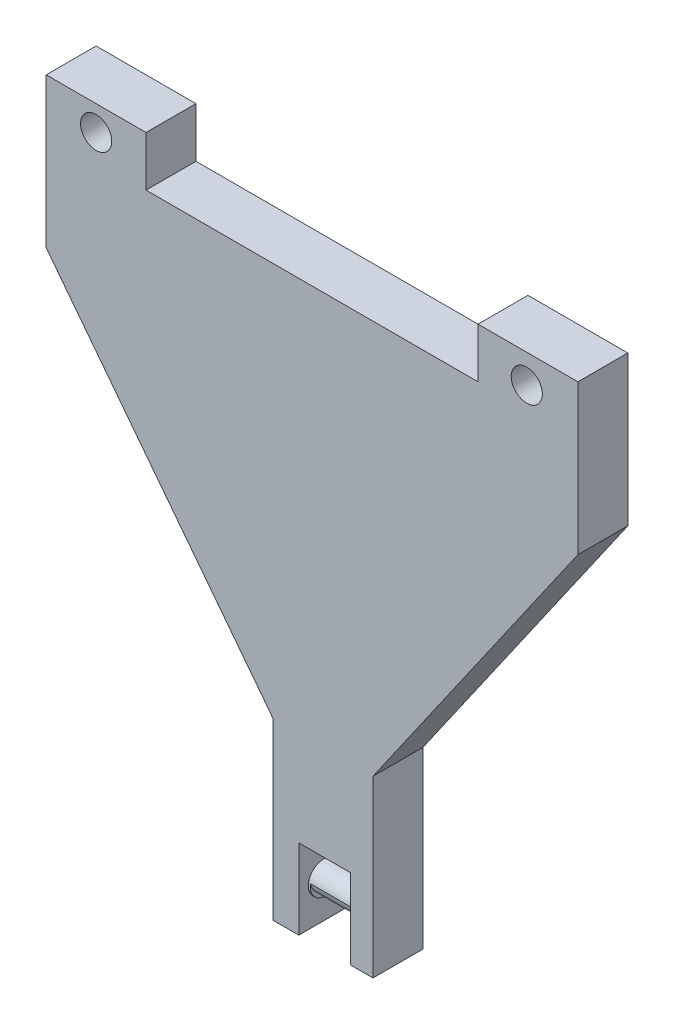
ISO-10303-21;
HEADER;
FILE_DESCRIPTION(('STEP AP214'),'2;1');
FILE_NAME('part.step','',(''),(''),'','','');
FILE_SCHEMA(('AUTOMOTIVE_DESIGN { 1 0 10303 214 1 1 1 1 }'));
ENDSEC;
DATA;
#1=APPLICATION_CONTEXT('core data for automotive mechanical design processes');
#2=APPLICATION_PROTOCOL_DEFINITION('international standard','automotive_design',2000,#1);
#3=PRODUCT_CONTEXT('',#1,'mechanical');
#4=PRODUCT('Part','Part','',(#3));
#5=PRODUCT_RELATED_PRODUCT_CATEGORY('part','',(#4));
#6=PRODUCT_DEFINITION_FORMATION('','',#4);
#7=PRODUCT_DEFINITION_CONTEXT('part definition',#1,'design');
#8=PRODUCT_DEFINITION('design','',#6,#7);
#9=PRODUCT_DEFINITION_SHAPE('','',#8);
#10=(LENGTH_UNIT() NAMED_UNIT(*) SI_UNIT(.MILLI.,.METRE.));
#11=(NAMED_UNIT(*) PLANE_ANGLE_UNIT() SI_UNIT($,.RADIAN.));
#12=(NAMED_UNIT(*) SI_UNIT($,.STERADIAN.) SOLID_ANGLE_UNIT());
#13=UNCERTAINTY_MEASURE_WITH_UNIT(LENGTH_MEASURE(1.E-05),#10,'distance_accuracy_value','');
#14=(GEOMETRIC_REPRESENTATION_CONTEXT(3) GLOBAL_UNCERTAINTY_ASSIGNED_CONTEXT((#13)) GLOBAL_UNIT_ASSIGNED_CONTEXT((#10,
#11,#12)) REPRESENTATION_CONTEXT('',''));
#15=CARTESIAN_POINT('',(0.,0.,0.));
#16=DIRECTION('',(0.,0.,1.));
#17=DIRECTION('',(1.,0.,0.));
#18=AXIS2_PLACEMENT_3D('',#15,#16,#17);
#19=CARTESIAN_POINT('',(0.,0.,0.));
#20=DIRECTION('',(0.,0.,1.));
#21=DIRECTION('',(1.,0.,0.));
#22=AXIS2_PLACEMENT_3D('',#19,#20,#21);
#23=PLANE('',#22);
#24=CARTESIAN_POINT('',(-21.971,38.1,0.));
#25=DIRECTION('',(0.,0.,1.));
#26=DIRECTION('',(1.,0.,0.));
#27=AXIS2_PLACEMENT_3D('',#24,#25,#26);
#28=CIRCLE('',#27,1.5875);
#29=CARTESIAN_POINT('',(-20.3835,38.1,0.));
#30=VERTEX_POINT('',#29);
#31=EDGE_CURVE('E209',#30,#30,#28,.T.);
#32=ORIENTED_EDGE('',*,*,#31,.T.);
#33=EDGE_LOOP('',(#32));
#34=FACE_BOUND('',#33,.T.);
#35=CARTESIAN_POINT('',(21.8511818454124,37.7412991391645,0.));
#36=DIRECTION('',(0.,0.,-1.));
#37=DIRECTION('',(-1.,0.,0.));
#38=AXIS2_PLACEMENT_3D('',#35,#36,#37);
#39=CIRCLE('',#38,1.5875);
#40=CARTESIAN_POINT('',(20.2636818454124,37.7412991391645,0.));
#41=VERTEX_POINT('',#40);
#42=EDGE_CURVE('E213',#41,#41,#39,.T.);
#43=ORIENTED_EDGE('',*,*,#42,.F.);
#44=EDGE_LOOP('',(#43));
#45=FACE_BOUND('',#44,.T.);
#46=DIRECTION('',(-1.,0.,0.));
#47=VECTOR('',#46,1.);
#48=CARTESIAN_POINT('',(3.93247962115445,-12.3472449566522,0.));
#49=LINE('',#48,#47);
#50=CARTESIAN_POINT('',(3.93247962115445,-12.3472449566522,0.));
#51=VERTEX_POINT('',#50);
#52=CARTESIAN_POINT('',(-1.14752037884556,-12.3472449566522,0.));
#53=VERTEX_POINT('',#52);
#54=EDGE_CURVE('E207',#51,#53,#49,.T.);
#55=ORIENTED_EDGE('',*,*,#54,.T.);
#56=DIRECTION('',(1.,0.,0.));
#57=VECTOR('',#56,1.);
#58=CARTESIAN_POINT('',(-6.94932177100705,-12.3472449566522,0.));
#59=LINE('',#58,#57);
#60=CARTESIAN_POINT('',(-1.34909444897592,-12.3472449566522,0.));
#61=VERTEX_POINT('',#60);
#62=EDGE_CURVE('E171',#61,#53,#59,.T.);
#63=ORIENTED_EDGE('',*,*,#62,.F.);
#64=DIRECTION('',(0.,1.,0.));
#65=VECTOR('',#64,1.);
#66=CARTESIAN_POINT('',(-1.34909444897592,0.,0.));
#67=LINE('',#66,#65);
#68=CARTESIAN_POINT('',(-1.34909444897592,-22.3246142518571,0.));
#69=VERTEX_POINT('',#68);
#70=EDGE_CURVE('E210',#69,#61,#67,.T.);
#71=ORIENTED_EDGE('',*,*,#70,.F.);
#72=DIRECTION('',(-1.,0.,0.));
#73=VECTOR('',#72,1.);
#74=CARTESIAN_POINT('',(0.,-22.3246142518571,0.));
#75=LINE('',#74,#73);
#76=CARTESIAN_POINT('',(-3.96283486472127,-22.3246142518571,0.));
#77=VERTEX_POINT('',#76);
#78=EDGE_CURVE('E251',#69,#77,#75,.T.);
#79=ORIENTED_EDGE('',*,*,#78,.T.);
#80=DIRECTION('',(0.,1.,0.));
#81=VECTOR('',#80,1.);
#82=CARTESIAN_POINT('',(-3.96283486472127,0.,0.));
#83=LINE('',#82,#81);
#84=CARTESIAN_POINT('',(-3.96283486472127,-4.54461425185706,0.));
#85=VERTEX_POINT('',#84);
#86=EDGE_CURVE('E272',#77,#85,#83,.T.);
#87=ORIENTED_EDGE('',*,*,#86,.T.);
#88=DIRECTION('',(-0.610605042103083,0.791935276748228,0.));
#89=VECTOR('',#88,1.);
#90=CARTESIAN_POINT('',(-4.68292957043946,-3.61067437135147,0.));
#91=LINE('',#90,#89);
#92=CARTESIAN_POINT('',(-27.051,25.4,0.));
#93=VERTEX_POINT('',#92);
#94=EDGE_CURVE('E317',#85,#93,#91,.T.);
#95=ORIENTED_EDGE('',*,*,#94,.T.);
#96=DIRECTION('',(0.,-1.,0.));
#97=VECTOR('',#96,1.);
#98=CARTESIAN_POINT('',(-27.051,30.48,0.));
#99=LINE('',#98,#97);
#100=CARTESIAN_POINT('',(-27.051,40.64,0.));
#101=VERTEX_POINT('',#100);
#102=EDGE_CURVE('E234',#101,#93,#99,.T.);
#103=ORIENTED_EDGE('',*,*,#102,.F.);
#104=DIRECTION('',(-1.,0.,0.));
#105=VECTOR('',#104,1.);
#106=CARTESIAN_POINT('',(-27.051,40.64,0.));
#107=LINE('',#106,#105);
#108=CARTESIAN_POINT('',(-16.891,40.64,0.));
#109=VERTEX_POINT('',#108);
#110=EDGE_CURVE('E230',#109,#101,#107,.T.);
#111=ORIENTED_EDGE('',*,*,#110,.F.);
#112=DIRECTION('',(0.,1.,0.));
#113=VECTOR('',#112,1.);
#114=CARTESIAN_POINT('',(-16.891,40.64,0.));
#115=LINE('',#114,#113);
#116=CARTESIAN_POINT('',(-16.891,35.56,0.));
#117=VERTEX_POINT('',#116);
#118=EDGE_CURVE('E226',#117,#109,#115,.T.);
#119=ORIENTED_EDGE('',*,*,#118,.F.);
#120=DIRECTION('',(-1.,0.,0.));
#121=VECTOR('',#120,1.);
#122=CARTESIAN_POINT('',(-16.891,35.56,0.));
#123=LINE('',#122,#121);
#124=CARTESIAN_POINT('',(16.891,35.56,0.));
#125=VERTEX_POINT('',#124);
#126=EDGE_CURVE('E222',#125,#117,#123,.T.);
#127=ORIENTED_EDGE('',*,*,#126,.F.);
#128=DIRECTION('',(0.,-1.,0.));
#129=VECTOR('',#128,1.);
#130=CARTESIAN_POINT('',(16.891,40.64,0.));
#131=LINE('',#130,#129);
#132=CARTESIAN_POINT('',(16.891,40.64,0.));
#133=VERTEX_POINT('',#132);
#134=EDGE_CURVE('E217',#133,#125,#131,.T.);
#135=ORIENTED_EDGE('',*,*,#134,.F.);
#136=DIRECTION('',(-1.,0.,0.));
#137=VECTOR('',#136,1.);
#138=CARTESIAN_POINT('',(27.051,40.64,0.));
#139=LINE('',#138,#137);
#140=CARTESIAN_POINT('',(27.051,40.64,0.));
#141=VERTEX_POINT('',#140);
#142=EDGE_CURVE('E218',#141,#133,#139,.T.);
#143=ORIENTED_EDGE('',*,*,#142,.F.);
#144=DIRECTION('',(0.,1.,0.));
#145=VECTOR('',#144,1.);
#146=CARTESIAN_POINT('',(27.051,40.64,0.));
#147=LINE('',#146,#145);
#148=CARTESIAN_POINT('',(27.051,25.4,0.));
#149=VERTEX_POINT('',#148);
#150=EDGE_CURVE('E249',#149,#141,#147,.T.);
#151=ORIENTED_EDGE('',*,*,#150,.F.);
#152=DIRECTION('',(0.571483757681356,0.820613377118846,0.));
#153=VECTOR('',#152,1.);
#154=CARTESIAN_POINT('',(6.3045469235923,-4.39055256328238,0.));
#155=LINE('',#154,#153);
#156=CARTESIAN_POINT('',(6.19725674875928,-4.54461425185706,0.));
#157=VERTEX_POINT('',#156);
#158=EDGE_CURVE('E292',#157,#149,#155,.T.);
#159=ORIENTED_EDGE('',*,*,#158,.F.);
#160=DIRECTION('',(0.,1.,0.));
#161=VECTOR('',#160,1.);
#162=CARTESIAN_POINT('',(6.19725674875928,0.,0.));
#163=LINE('',#162,#161);
#164=CARTESIAN_POINT('',(6.19725674875928,-22.3246142518571,0.));
#165=VERTEX_POINT('',#164);
#166=EDGE_CURVE('E288',#165,#157,#163,.T.);
#167=ORIENTED_EDGE('',*,*,#166,.F.);
#168=DIRECTION('',(1.,0.,0.));
#169=VECTOR('',#168,1.);
#170=CARTESIAN_POINT('',(0.,-22.3246142518571,0.));
#171=LINE('',#170,#169);
#172=CARTESIAN_POINT('',(3.93247962115445,-22.3246142518571,0.));
#173=VERTEX_POINT('',#172);
#174=EDGE_CURVE('E282',#173,#165,#171,.T.);
#175=ORIENTED_EDGE('',*,*,#174,.F.);
#176=DIRECTION('',(0.,-1.,0.));
#177=VECTOR('',#176,1.);
#178=CARTESIAN_POINT('',(3.93247962115444,0.,0.));
#179=LINE('',#178,#177);
#180=EDGE_CURVE('E56',#51,#173,#179,.T.);
#181=ORIENTED_EDGE('',*,*,#180,.F.);
#182=EDGE_LOOP('',(#55,#63,#71,#79,#87,#95,#103,#111,#119,#127,#135,#143,#151,#159,#167,#175,#181));
#183=FACE_BOUND('',#182,.T.);
#184=ADVANCED_FACE('F34',(#34,#45,#183),#23,.F.);
#185=CARTESIAN_POINT('',(3.73090555102408,-4.12298634862399,-50.0634));
#186=DIRECTION('',(-1.,0.,0.));
#187=DIRECTION('',(0.,1.,0.));
#188=AXIS2_PLACEMENT_3D('',#185,#186,#187);
#189=PLANE('',#188);
#190=CARTESIAN_POINT('',(3.73090555102408,-18.4560908265641,2.51857716498938));
#191=DIRECTION('',(-1.,0.,0.));
#192=DIRECTION('',(0.,1.,0.));
#193=AXIS2_PLACEMENT_3D('',#190,#191,#192);
#194=CIRCLE('',#193,1.5875);
#195=CARTESIAN_POINT('',(3.73090555102408,-18.1969949144053,4.0847909301896));
#196=VERTEX_POINT('',#195);
#197=CARTESIAN_POINT('',(3.73090555102408,-18.1969949144053,0.952363399789171));
#198=VERTEX_POINT('',#197);
#199=EDGE_CURVE('E279',#196,#198,#194,.T.);
#200=ORIENTED_EDGE('',*,*,#199,.F.);
#201=CARTESIAN_POINT('',(3.73090555102408,-17.9378990022466,2.51857716498938));
#202=DIRECTION('',(-1.,0.,0.));
#203=DIRECTION('',(0.,-1.,0.));
#204=AXIS2_PLACEMENT_3D('',#201,#202,#203);
#205=CIRCLE('',#204,1.5875);
#206=EDGE_CURVE('E48',#196,#198,#205,.T.);
#207=ORIENTED_EDGE('',*,*,#206,.T.);
#208=EDGE_LOOP('',(#200,#207));
#209=FACE_BOUND('',#208,.T.);
#210=ADVANCED_FACE('F341',(#209),#189,.T.);
#211=CARTESIAN_POINT('',(0.,0.,5.08));
#212=DIRECTION('',(0.,0.,1.));
#213=DIRECTION('',(1.,0.,0.));
#214=AXIS2_PLACEMENT_3D('',#211,#212,#213);
#215=PLANE('',#214);
#216=DIRECTION('',(1.,0.,0.));
#217=VECTOR('',#216,1.);
#218=CARTESIAN_POINT('',(-6.94932177100705,-14.1862009975363,5.07999999999998));
#219=LINE('',#218,#217);
#220=CARTESIAN_POINT('',(-1.34909444897592,-14.1862009975363,5.07999999999998));
#221=VERTEX_POINT('',#220);
#222=CARTESIAN_POINT('',(-1.14752037884555,-14.1862009975363,5.07999999999998));
#223=VERTEX_POINT('',#222);
#224=EDGE_CURVE('E169',#221,#223,#219,.T.);
#225=ORIENTED_EDGE('',*,*,#224,.T.);
#226=DIRECTION('',(-1.,0.,0.));
#227=VECTOR('',#226,1.);
#228=CARTESIAN_POINT('',(3.93247962115445,-14.1862009975362,5.08));
#229=LINE('',#228,#227);
#230=CARTESIAN_POINT('',(3.93247962115445,-14.1862009975363,5.07999999999998));
#231=VERTEX_POINT('',#230);
#232=EDGE_CURVE('E11',#231,#223,#229,.T.);
#233=ORIENTED_EDGE('',*,*,#232,.F.);
#234=DIRECTION('',(0.,-1.,0.));
#235=VECTOR('',#234,1.);
#236=CARTESIAN_POINT('',(3.93247962115444,0.,5.08));
#237=LINE('',#236,#235);
#238=CARTESIAN_POINT('',(3.93247962115445,-22.3246142518571,5.08));
#239=VERTEX_POINT('',#238);
#240=EDGE_CURVE('E196',#231,#239,#237,.T.);
#241=ORIENTED_EDGE('',*,*,#240,.T.);
#242=DIRECTION('',(1.,0.,0.));
#243=VECTOR('',#242,1.);
#244=CARTESIAN_POINT('',(0.,-22.3246142518571,5.08));
#245=LINE('',#244,#243);
#246=CARTESIAN_POINT('',(6.19725674875928,-22.3246142518571,5.08));
#247=VERTEX_POINT('',#246);
#248=EDGE_CURVE('E278',#239,#247,#245,.T.);
#249=ORIENTED_EDGE('',*,*,#248,.T.);
#250=DIRECTION('',(0.,1.,0.));
#251=VECTOR('',#250,1.);
#252=CARTESIAN_POINT('',(6.19725674875928,0.,5.08));
#253=LINE('',#252,#251);
#254=CARTESIAN_POINT('',(6.19725674875928,-4.54461425185706,5.08));
#255=VERTEX_POINT('',#254);
#256=EDGE_CURVE('E312',#247,#255,#253,.T.);
#257=ORIENTED_EDGE('',*,*,#256,.T.);
#258=DIRECTION('',(0.571483757681356,0.820613377118846,0.));
#259=VECTOR('',#258,1.);
#260=CARTESIAN_POINT('',(6.3045469235923,-4.39055256328238,5.08));
#261=LINE('',#260,#259);
#262=CARTESIAN_POINT('',(27.051,25.4,5.08));
#263=VERTEX_POINT('',#262);
#264=EDGE_CURVE('E267',#255,#263,#261,.T.);
#265=ORIENTED_EDGE('',*,*,#264,.T.);
#266=DIRECTION('',(0.,1.,0.));
#267=VECTOR('',#266,1.);
#268=CARTESIAN_POINT('',(27.051,-40.64,5.08));
#269=LINE('',#268,#267);
#270=CARTESIAN_POINT('',(27.051,40.64,5.08));
#271=VERTEX_POINT('',#270);
#272=EDGE_CURVE('E265',#263,#271,#269,.T.);
#273=ORIENTED_EDGE('',*,*,#272,.T.);
#274=DIRECTION('',(-1.,0.,0.));
#275=VECTOR('',#274,1.);
#276=CARTESIAN_POINT('',(27.051,40.64,5.08));
#277=LINE('',#276,#275);
#278=CARTESIAN_POINT('',(16.891,40.64,5.08));
#279=VERTEX_POINT('',#278);
#280=EDGE_CURVE('E263',#271,#279,#277,.T.);
#281=ORIENTED_EDGE('',*,*,#280,.T.);
#282=DIRECTION('',(0.,-1.,0.));
#283=VECTOR('',#282,1.);
#284=CARTESIAN_POINT('',(16.891,40.64,5.08));
#285=LINE('',#284,#283);
#286=CARTESIAN_POINT('',(16.891,35.56,5.08));
#287=VERTEX_POINT('',#286);
#288=EDGE_CURVE('E261',#279,#287,#285,.T.);
#289=ORIENTED_EDGE('',*,*,#288,.T.);
#290=DIRECTION('',(-1.,0.,0.));
#291=VECTOR('',#290,1.);
#292=CARTESIAN_POINT('',(-16.891,35.56,5.08));
#293=LINE('',#292,#291);
#294=CARTESIAN_POINT('',(-16.891,35.56,5.08));
#295=VERTEX_POINT('',#294);
#296=EDGE_CURVE('E259',#287,#295,#293,.T.);
#297=ORIENTED_EDGE('',*,*,#296,.T.);
#298=DIRECTION('',(0.,1.,0.));
#299=VECTOR('',#298,1.);
#300=CARTESIAN_POINT('',(-16.891,40.64,5.08));
#301=LINE('',#300,#299);
#302=CARTESIAN_POINT('',(-16.891,40.64,5.08));
#303=VERTEX_POINT('',#302);
#304=EDGE_CURVE('E257',#295,#303,#301,.T.);
#305=ORIENTED_EDGE('',*,*,#304,.T.);
#306=DIRECTION('',(-1.,0.,0.));
#307=VECTOR('',#306,1.);
#308=CARTESIAN_POINT('',(-27.051,40.64,5.08));
#309=LINE('',#308,#307);
#310=CARTESIAN_POINT('',(-27.051,40.64,5.08));
#311=VERTEX_POINT('',#310);
#312=EDGE_CURVE('E255',#303,#311,#309,.T.);
#313=ORIENTED_EDGE('',*,*,#312,.T.);
#314=DIRECTION('',(0.,-1.,0.));
#315=VECTOR('',#314,1.);
#316=CARTESIAN_POINT('',(-27.051,40.64,5.08));
#317=LINE('',#316,#315);
#318=CARTESIAN_POINT('',(-27.051,25.4,5.08));
#319=VERTEX_POINT('',#318);
#320=EDGE_CURVE('E252',#311,#319,#317,.T.);
#321=ORIENTED_EDGE('',*,*,#320,.T.);
#322=DIRECTION('',(-0.610605042103083,0.791935276748228,0.));
#323=VECTOR('',#322,1.);
#324=CARTESIAN_POINT('',(-4.68292957043946,-3.61067437135147,5.08));
#325=LINE('',#324,#323);
#326=CARTESIAN_POINT('',(-3.96283486472127,-4.54461425185706,5.08));
#327=VERTEX_POINT('',#326);
#328=EDGE_CURVE('E287',#327,#319,#325,.T.);
#329=ORIENTED_EDGE('',*,*,#328,.F.);
#330=DIRECTION('',(0.,1.,0.));
#331=VECTOR('',#330,1.);
#332=CARTESIAN_POINT('',(-3.96283486472127,0.,5.08));
#333=LINE('',#332,#331);
#334=CARTESIAN_POINT('',(-3.96283486472127,-22.3246142518571,5.08));
#335=VERTEX_POINT('',#334);
#336=EDGE_CURVE('E299',#335,#327,#333,.T.);
#337=ORIENTED_EDGE('',*,*,#336,.F.);
#338=DIRECTION('',(-1.,0.,0.));
#339=VECTOR('',#338,1.);
#340=CARTESIAN_POINT('',(0.,-22.3246142518571,5.08));
#341=LINE('',#340,#339);
#342=CARTESIAN_POINT('',(-1.34909444897592,-22.3246142518571,5.08));
#343=VERTEX_POINT('',#342);
#344=EDGE_CURVE('E296',#343,#335,#341,.T.);
#345=ORIENTED_EDGE('',*,*,#344,.F.);
#346=DIRECTION('',(0.,1.,0.));
#347=VECTOR('',#346,1.);
#348=CARTESIAN_POINT('',(-1.34909444897592,0.,5.08));
#349=LINE('',#348,#347);
#350=EDGE_CURVE('E183',#343,#221,#349,.T.);
#351=ORIENTED_EDGE('',*,*,#350,.T.);
#352=EDGE_LOOP('',(#225,#233,#241,#249,#257,#265,#273,#281,#289,#297,#305,#313,#321,#329,#337,
#345,#351));
#353=FACE_BOUND('',#352,.T.);
#354=CARTESIAN_POINT('',(21.8511818454124,37.7412991391645,5.08));
#355=DIRECTION('',(0.,0.,-1.));
#356=DIRECTION('',(-1.,0.,0.));
#357=AXIS2_PLACEMENT_3D('',#354,#355,#356);
#358=CIRCLE('',#357,1.5875);
#359=CARTESIAN_POINT('',(20.2636818454124,37.7412991391645,5.08));
#360=VERTEX_POINT('',#359);
#361=EDGE_CURVE('E248',#360,#360,#358,.T.);
#362=ORIENTED_EDGE('',*,*,#361,.T.);
#363=EDGE_LOOP('',(#362));
#364=FACE_BOUND('',#363,.T.);
#365=CARTESIAN_POINT('',(-21.971,38.1,5.08));
#366=DIRECTION('',(0.,0.,1.));
#367=DIRECTION('',(1.,0.,0.));
#368=AXIS2_PLACEMENT_3D('',#365,#366,#367);
#369=CIRCLE('',#368,1.5875);
#370=CARTESIAN_POINT('',(-20.3835,38.1,5.08));
#371=VERTEX_POINT('',#370);
#372=EDGE_CURVE('E238',#371,#371,#369,.T.);
#373=ORIENTED_EDGE('',*,*,#372,.F.);
#374=EDGE_LOOP('',(#373));
#375=FACE_BOUND('',#374,.T.);
#376=ADVANCED_FACE('F178',(#353,#364,#375),#215,.T.);
#377=CARTESIAN_POINT('',(3.73093055102408,-18.4560908265641,2.51857716498938));
#378=DIRECTION('',(-1.,0.,0.));
#379=DIRECTION('',(0.,1.,0.));
#380=AXIS2_PLACEMENT_3D('',#377,#378,#379);
#381=CYLINDRICAL_SURFACE('',#380,1.5875);
#382=CARTESIAN_POINT('',(-1.34909444897592,-18.4560908265641,2.51857716498938));
#383=DIRECTION('',(-1.,0.,0.));
#384=DIRECTION('',(0.,1.,0.));
#385=AXIS2_PLACEMENT_3D('',#382,#383,#384);
#386=CIRCLE('',#385,1.5875);
#387=CARTESIAN_POINT('',(-1.34909444897592,-16.8685908265641,2.51857716498938));
#388=VERTEX_POINT('',#387);
#389=EDGE_CURVE('E212',#388,#388,#386,.T.);
#390=ORIENTED_EDGE('',*,*,#389,.F.);
#391=EDGE_LOOP('',(#390));
#392=FACE_BOUND('',#391,.T.);
#393=ORIENTED_EDGE('',*,*,#199,.T.);
#394=DIRECTION('',(-1.,0.,0.));
#395=VECTOR('',#394,1.);
#396=CARTESIAN_POINT('',(1.39247962115445,-18.1969949144053,0.95236339978917));
#397=LINE('',#396,#395);
#398=CARTESIAN_POINT('',(-1.14752037884555,-18.1969949144053,0.95236339978917));
#399=VERTEX_POINT('',#398);
#400=EDGE_CURVE('E41',#198,#399,#397,.T.);
#401=ORIENTED_EDGE('',*,*,#400,.T.);
#402=CARTESIAN_POINT('',(-1.14752037884555,-18.4560908265641,2.51857716498938));
#403=DIRECTION('',(1.,0.,0.));
#404=DIRECTION('',(0.,1.,0.));
#405=AXIS2_PLACEMENT_3D('',#402,#403,#404);
#406=CIRCLE('',#405,1.5875);
#407=CARTESIAN_POINT('',(-1.14752037884555,-18.1969949144053,4.0847909301896));
#408=VERTEX_POINT('',#407);
#409=EDGE_CURVE('E330',#399,#408,#406,.F.);
#410=ORIENTED_EDGE('',*,*,#409,.T.);
#411=DIRECTION('',(-1.,0.,0.));
#412=VECTOR('',#411,1.);
#413=CARTESIAN_POINT('',(1.39247962115445,-18.1969949144053,4.0847909301896));
#414=LINE('',#413,#412);
#415=EDGE_CURVE('E328',#408,#196,#414,.F.);
#416=ORIENTED_EDGE('',*,*,#415,.T.);
#417=EDGE_LOOP('',(#393,#401,#410,#416));
#418=FACE_BOUND('',#417,.T.);
#419=ADVANCED_FACE('F334',(#392,#418),#381,.T.);
#420=CARTESIAN_POINT('',(0.,-22.3246142518571,0.));
#421=DIRECTION('',(0.,-1.,0.));
#422=DIRECTION('',(0.,0.,-1.));
#423=AXIS2_PLACEMENT_3D('',#420,#421,#422);
#424=PLANE('',#423);
#425=ORIENTED_EDGE('',*,*,#248,.F.);
#426=DIRECTION('',(0.,0.,-1.));
#427=VECTOR('',#426,1.);
#428=CARTESIAN_POINT('',(3.93247962115445,-22.3246142518571,0.));
#429=LINE('',#428,#427);
#430=EDGE_CURVE('E295',#239,#173,#429,.T.);
#431=ORIENTED_EDGE('',*,*,#430,.T.);
#432=ORIENTED_EDGE('',*,*,#174,.T.);
#433=DIRECTION('',(0.,0.,1.));
#434=VECTOR('',#433,1.);
#435=CARTESIAN_POINT('',(6.19725674875928,-22.3246142518571,0.));
#436=LINE('',#435,#434);
#437=EDGE_CURVE('E289',#165,#247,#436,.T.);
#438=ORIENTED_EDGE('',*,*,#437,.T.);
#439=EDGE_LOOP('',(#425,#431,#432,#438));
#440=FACE_BOUND('',#439,.T.);
#441=ADVANCED_FACE('F358',(#440),#424,.T.);
#442=CARTESIAN_POINT('',(27.051,40.64,5.08));
#443=DIRECTION('',(-1.,0.,0.));
#444=DIRECTION('',(0.,-1.,0.));
#445=AXIS2_PLACEMENT_3D('',#442,#443,#444);
#446=PLANE('',#445);
#447=DIRECTION('',(0.,0.,1.));
#448=VECTOR('',#447,1.);
#449=CARTESIAN_POINT('',(27.051,25.4,0.));
#450=LINE('',#449,#448);
#451=EDGE_CURVE('E304',#149,#263,#450,.T.);
#452=ORIENTED_EDGE('',*,*,#451,.F.);
#453=ORIENTED_EDGE('',*,*,#150,.T.);
#454=DIRECTION('',(0.,0.,-1.));
#455=VECTOR('',#454,1.);
#456=CARTESIAN_POINT('',(27.051,40.64,5.08));
#457=LINE('',#456,#455);
#458=EDGE_CURVE('E214',#271,#141,#457,.T.);
#459=ORIENTED_EDGE('',*,*,#458,.F.);
#460=ORIENTED_EDGE('',*,*,#272,.F.);
#461=EDGE_LOOP('',(#452,#453,#459,#460));
#462=FACE_BOUND('',#461,.T.);
#463=ADVANCED_FACE('F371',(#462),#446,.F.);
#464=CARTESIAN_POINT('',(27.051,40.64,5.08));
#465=DIRECTION('',(0.,-1.,0.));
#466=DIRECTION('',(1.,0.,0.));
#467=AXIS2_PLACEMENT_3D('',#464,#465,#466);
#468=PLANE('',#467);
#469=ORIENTED_EDGE('',*,*,#142,.T.);
#470=DIRECTION('',(0.,0.,-1.));
#471=VECTOR('',#470,1.);
#472=CARTESIAN_POINT('',(16.891,40.64,5.08));
#473=LINE('',#472,#471);
#474=EDGE_CURVE('E219',#279,#133,#473,.T.);
#475=ORIENTED_EDGE('',*,*,#474,.F.);
#476=ORIENTED_EDGE('',*,*,#280,.F.);
#477=ORIENTED_EDGE('',*,*,#458,.T.);
#478=EDGE_LOOP('',(#469,#475,#476,#477));
#479=FACE_BOUND('',#478,.T.);
#480=ADVANCED_FACE('F513',(#479),#468,.F.);
#481=CARTESIAN_POINT('',(16.891,40.64,5.08));
#482=DIRECTION('',(1.,0.,0.));
#483=DIRECTION('',(0.,0.,-1.));
#484=AXIS2_PLACEMENT_3D('',#481,#482,#483);
#485=PLANE('',#484);
#486=ORIENTED_EDGE('',*,*,#134,.T.);
#487=DIRECTION('',(0.,0.,-1.));
#488=VECTOR('',#487,1.);
#489=CARTESIAN_POINT('',(16.891,35.56,5.08));
#490=LINE('',#489,#488);
#491=EDGE_CURVE('E223',#287,#125,#490,.T.);
#492=ORIENTED_EDGE('',*,*,#491,.F.);
#493=ORIENTED_EDGE('',*,*,#288,.F.);
#494=ORIENTED_EDGE('',*,*,#474,.T.);
#495=EDGE_LOOP('',(#486,#492,#493,#494));
#496=FACE_BOUND('',#495,.T.);
#497=ADVANCED_FACE('F505',(#496),#485,.F.);
#498=CARTESIAN_POINT('',(-16.891,35.56,5.08));
#499=DIRECTION('',(0.,-1.,0.));
#500=DIRECTION('',(0.,0.,-1.));
#501=AXIS2_PLACEMENT_3D('',#498,#499,#500);
#502=PLANE('',#501);
#503=ORIENTED_EDGE('',*,*,#126,.T.);
#504=DIRECTION('',(0.,0.,-1.));
#505=VECTOR('',#504,1.);
#506=CARTESIAN_POINT('',(-16.891,35.56,5.08));
#507=LINE('',#506,#505);
#508=EDGE_CURVE('E227',#295,#117,#507,.T.);
#509=ORIENTED_EDGE('',*,*,#508,.F.);
#510=ORIENTED_EDGE('',*,*,#296,.F.);
#511=ORIENTED_EDGE('',*,*,#491,.T.);
#512=EDGE_LOOP('',(#503,#509,#510,#511));
#513=FACE_BOUND('',#512,.T.);
#514=ADVANCED_FACE('F497',(#513),#502,.F.);
#515=CARTESIAN_POINT('',(-16.891,40.64,5.08));
#516=DIRECTION('',(-1.,0.,0.));
#517=DIRECTION('',(0.,-1.,0.));
#518=AXIS2_PLACEMENT_3D('',#515,#516,#517);
#519=PLANE('',#518);
#520=ORIENTED_EDGE('',*,*,#118,.T.);
#521=DIRECTION('',(0.,0.,-1.));
#522=VECTOR('',#521,1.);
#523=CARTESIAN_POINT('',(-16.891,40.64,5.08));
#524=LINE('',#523,#522);
#525=EDGE_CURVE('E231',#303,#109,#524,.T.);
#526=ORIENTED_EDGE('',*,*,#525,.F.);
#527=ORIENTED_EDGE('',*,*,#304,.F.);
#528=ORIENTED_EDGE('',*,*,#508,.T.);
#529=EDGE_LOOP('',(#520,#526,#527,#528));
#530=FACE_BOUND('',#529,.T.);
#531=ADVANCED_FACE('F490',(#530),#519,.F.);
#532=CARTESIAN_POINT('',(-27.051,40.64,5.08));
#533=DIRECTION('',(0.,-1.,0.));
#534=DIRECTION('',(1.,0.,0.));
#535=AXIS2_PLACEMENT_3D('',#532,#533,#534);
#536=PLANE('',#535);
#537=ORIENTED_EDGE('',*,*,#110,.T.);
#538=DIRECTION('',(0.,0.,-1.));
#539=VECTOR('',#538,1.);
#540=CARTESIAN_POINT('',(-27.051,40.64,5.08));
#541=LINE('',#540,#539);
#542=EDGE_CURVE('E235',#311,#101,#541,.T.);
#543=ORIENTED_EDGE('',*,*,#542,.F.);
#544=ORIENTED_EDGE('',*,*,#312,.F.);
#545=ORIENTED_EDGE('',*,*,#525,.T.);
#546=EDGE_LOOP('',(#537,#543,#544,#545));
#547=FACE_BOUND('',#546,.T.);
#548=ADVANCED_FACE('F395',(#547),#536,.F.);
#549=CARTESIAN_POINT('',(-27.051,30.48,5.08));
#550=DIRECTION('',(1.,0.,0.));
#551=DIRECTION('',(0.,1.,0.));
#552=AXIS2_PLACEMENT_3D('',#549,#550,#551);
#553=PLANE('',#552);
#554=ORIENTED_EDGE('',*,*,#102,.T.);
#555=DIRECTION('',(0.,0.,1.));
#556=VECTOR('',#555,1.);
#557=CARTESIAN_POINT('',(-27.051,25.4,0.));
#558=LINE('',#557,#556);
#559=EDGE_CURVE('E239',#93,#319,#558,.T.);
#560=ORIENTED_EDGE('',*,*,#559,.T.);
#561=ORIENTED_EDGE('',*,*,#320,.F.);
#562=ORIENTED_EDGE('',*,*,#542,.T.);
#563=EDGE_LOOP('',(#554,#560,#561,#562));
#564=FACE_BOUND('',#563,.T.);
#565=ADVANCED_FACE('F389',(#564),#553,.F.);
#566=CARTESIAN_POINT('',(-21.971,38.1,0.));
#567=DIRECTION('',(0.,0.,1.));
#568=DIRECTION('',(1.,0.,0.));
#569=AXIS2_PLACEMENT_3D('',#566,#567,#568);
#570=CYLINDRICAL_SURFACE('',#569,1.5875);
#571=ORIENTED_EDGE('',*,*,#31,.F.);
#572=EDGE_LOOP('',(#571));
#573=FACE_BOUND('',#572,.T.);
#574=ORIENTED_EDGE('',*,*,#372,.T.);
#575=EDGE_LOOP('',(#574));
#576=FACE_BOUND('',#575,.T.);
#577=ADVANCED_FACE('F469',(#573,#576),#570,.F.);
#578=CARTESIAN_POINT('',(21.8511818454124,37.7412991391645,5.08));
#579=DIRECTION('',(0.,0.,-1.));
#580=DIRECTION('',(-1.,0.,0.));
#581=AXIS2_PLACEMENT_3D('',#578,#579,#580);
#582=CYLINDRICAL_SURFACE('',#581,1.5875);
#583=ORIENTED_EDGE('',*,*,#361,.F.);
#584=EDGE_LOOP('',(#583));
#585=FACE_BOUND('',#584,.T.);
#586=ORIENTED_EDGE('',*,*,#42,.T.);
#587=EDGE_LOOP('',(#586));
#588=FACE_BOUND('',#587,.T.);
#589=ADVANCED_FACE('F465',(#585,#588),#582,.F.);
#590=CARTESIAN_POINT('',(-1.34909444897592,-4.12298634862399,-50.0634));
#591=DIRECTION('',(1.,0.,0.));
#592=DIRECTION('',(0.,-1.,0.));
#593=AXIS2_PLACEMENT_3D('',#590,#591,#592);
#594=PLANE('',#593);
#595=ORIENTED_EDGE('',*,*,#70,.T.);
#596=DIRECTION('',(0.,0.340383103525389,-0.940286840721715));
#597=VECTOR('',#596,1.);
#598=CARTESIAN_POINT('',(-1.34909444897592,-14.1862009975363,5.07999999999998));
#599=LINE('',#598,#597);
#600=EDGE_CURVE('E185',#221,#61,#599,.T.);
#601=ORIENTED_EDGE('',*,*,#600,.F.);
#602=ORIENTED_EDGE('',*,*,#350,.F.);
#603=DIRECTION('',(0.,0.,1.));
#604=VECTOR('',#603,1.);
#605=CARTESIAN_POINT('',(-1.34909444897592,-22.3246142518571,0.));
#606=LINE('',#605,#604);
#607=EDGE_CURVE('E293',#69,#343,#606,.T.);
#608=ORIENTED_EDGE('',*,*,#607,.F.);
#609=EDGE_LOOP('',(#595,#601,#602,#608));
#610=FACE_BOUND('',#609,.T.);
#611=ORIENTED_EDGE('',*,*,#389,.T.);
#612=EDGE_LOOP('',(#611));
#613=FACE_BOUND('',#612,.T.);
#614=ADVANCED_FACE('F354',(#610,#613),#594,.T.);
#615=CARTESIAN_POINT('',(6.3045469235923,-4.39055256328238,0.));
#616=DIRECTION('',(0.820613377118846,-0.571483757681356,0.));
#617=DIRECTION('',(0.571483757681356,0.820613377118846,0.));
#618=AXIS2_PLACEMENT_3D('',#615,#616,#617);
#619=PLANE('',#618);
#620=ORIENTED_EDGE('',*,*,#264,.F.);
#621=DIRECTION('',(0.,0.,1.));
#622=VECTOR('',#621,1.);
#623=CARTESIAN_POINT('',(6.19725674875928,-4.54461425185706,0.));
#624=LINE('',#623,#622);
#625=EDGE_CURVE('E285',#157,#255,#624,.T.);
#626=ORIENTED_EDGE('',*,*,#625,.F.);
#627=ORIENTED_EDGE('',*,*,#158,.T.);
#628=ORIENTED_EDGE('',*,*,#451,.T.);
#629=EDGE_LOOP('',(#620,#626,#627,#628));
#630=FACE_BOUND('',#629,.T.);
#631=ADVANCED_FACE('F360',(#630),#619,.T.);
#632=CARTESIAN_POINT('',(6.19725674875928,0.,0.));
#633=DIRECTION('',(1.,0.,0.));
#634=DIRECTION('',(0.,0.,-1.));
#635=AXIS2_PLACEMENT_3D('',#632,#633,#634);
#636=PLANE('',#635);
#637=ORIENTED_EDGE('',*,*,#256,.F.);
#638=ORIENTED_EDGE('',*,*,#437,.F.);
#639=ORIENTED_EDGE('',*,*,#166,.T.);
#640=ORIENTED_EDGE('',*,*,#625,.T.);
#641=EDGE_LOOP('',(#637,#638,#639,#640));
#642=FACE_BOUND('',#641,.T.);
#643=ADVANCED_FACE('F363',(#642),#636,.T.);
#644=CARTESIAN_POINT('',(-4.68292957043946,-3.61067437135147,0.));
#645=DIRECTION('',(0.791935276748228,0.610605042103083,0.));
#646=DIRECTION('',(-0.610605042103083,0.791935276748228,0.));
#647=AXIS2_PLACEMENT_3D('',#644,#645,#646);
#648=PLANE('',#647);
#649=ORIENTED_EDGE('',*,*,#328,.T.);
#650=ORIENTED_EDGE('',*,*,#559,.F.);
#651=ORIENTED_EDGE('',*,*,#94,.F.);
#652=DIRECTION('',(0.,0.,1.));
#653=VECTOR('',#652,1.);
#654=CARTESIAN_POINT('',(-3.96283486472127,-4.54461425185706,0.));
#655=LINE('',#654,#653);
#656=EDGE_CURVE('E300',#85,#327,#655,.T.);
#657=ORIENTED_EDGE('',*,*,#656,.T.);
#658=EDGE_LOOP('',(#649,#650,#651,#657));
#659=FACE_BOUND('',#658,.T.);
#660=ADVANCED_FACE('F367',(#659),#648,.F.);
#661=CARTESIAN_POINT('',(-3.96283486472127,0.,0.));
#662=DIRECTION('',(1.,0.,0.));
#663=DIRECTION('',(0.,0.,-1.));
#664=AXIS2_PLACEMENT_3D('',#661,#662,#663);
#665=PLANE('',#664);
#666=ORIENTED_EDGE('',*,*,#336,.T.);
#667=ORIENTED_EDGE('',*,*,#656,.F.);
#668=ORIENTED_EDGE('',*,*,#86,.F.);
#669=DIRECTION('',(0.,0.,1.));
#670=VECTOR('',#669,1.);
#671=CARTESIAN_POINT('',(-3.96283486472127,-22.3246142518571,0.));
#672=LINE('',#671,#670);
#673=EDGE_CURVE('E297',#77,#335,#672,.T.);
#674=ORIENTED_EDGE('',*,*,#673,.T.);
#675=EDGE_LOOP('',(#666,#667,#668,#674));
#676=FACE_BOUND('',#675,.T.);
#677=ADVANCED_FACE('F376',(#676),#665,.F.);
#678=CARTESIAN_POINT('',(0.,-22.3246142518571,0.));
#679=DIRECTION('',(0.,1.,0.));
#680=DIRECTION('',(0.,0.,1.));
#681=AXIS2_PLACEMENT_3D('',#678,#679,#680);
#682=PLANE('',#681);
#683=ORIENTED_EDGE('',*,*,#344,.T.);
#684=ORIENTED_EDGE('',*,*,#673,.F.);
#685=ORIENTED_EDGE('',*,*,#78,.F.);
#686=ORIENTED_EDGE('',*,*,#607,.T.);
#687=EDGE_LOOP('',(#683,#684,#685,#686));
#688=FACE_BOUND('',#687,.T.);
#689=ADVANCED_FACE('F373',(#688),#682,.F.);
#690=CARTESIAN_POINT('',(3.93247962115455,-167.054963155875,-53.13122308931));
#691=DIRECTION('',(-1.,0.,0.));
#692=DIRECTION('',(0.,1.,0.));
#693=AXIS2_PLACEMENT_3D('',#690,#691,#692);
#694=CYLINDRICAL_SURFACE('',#693,163.576908325644);
#695=CARTESIAN_POINT('',(3.93247962115455,-167.054963155875,-53.13122308931));
#696=DIRECTION('',(-1.,0.,0.));
#697=DIRECTION('',(0.,1.,0.));
#698=AXIS2_PLACEMENT_3D('',#695,#696,#697);
#699=CIRCLE('',#698,163.576908325644);
#700=EDGE_CURVE('E192',#231,#51,#699,.T.);
#701=ORIENTED_EDGE('',*,*,#700,.F.);
#702=ORIENTED_EDGE('',*,*,#232,.T.);
#703=CARTESIAN_POINT('',(-1.14752037884545,-167.054963155875,-53.13122308931));
#704=DIRECTION('',(-1.,0.,0.));
#705=DIRECTION('',(0.,1.,0.));
#706=AXIS2_PLACEMENT_3D('',#703,#704,#705);
#707=CIRCLE('',#706,163.576908325644);
#708=EDGE_CURVE('E190',#223,#53,#707,.T.);
#709=ORIENTED_EDGE('',*,*,#708,.T.);
#710=ORIENTED_EDGE('',*,*,#54,.F.);
#711=EDGE_LOOP('',(#701,#702,#709,#710));
#712=FACE_BOUND('',#711,.T.);
#713=ADVANCED_FACE('F189',(#712),#694,.F.);
#714=CARTESIAN_POINT('',(-1.14752037884556,-3.60479452430651,-50.0634));
#715=DIRECTION('',(1.,0.,0.));
#716=DIRECTION('',(0.,-1.,0.));
#717=AXIS2_PLACEMENT_3D('',#714,#715,#716);
#718=PLANE('',#717);
#719=DIRECTION('',(0.,-0.340383103525389,0.940286840721715));
#720=VECTOR('',#719,1.);
#721=CARTESIAN_POINT('',(-1.14752037884555,-14.1862009975363,5.07999999999998));
#722=LINE('',#721,#720);
#723=EDGE_CURVE('E165',#53,#223,#722,.T.);
#724=ORIENTED_EDGE('',*,*,#723,.F.);
#725=ORIENTED_EDGE('',*,*,#708,.F.);
#726=EDGE_LOOP('',(#724,#725));
#727=FACE_BOUND('',#726,.T.);
#728=ADVANCED_FACE('F193',(#727),#718,.T.);
#729=CARTESIAN_POINT('',(3.93247962115444,-3.60479452430651,-50.0634));
#730=DIRECTION('',(-1.,0.,0.));
#731=DIRECTION('',(0.,1.,0.));
#732=AXIS2_PLACEMENT_3D('',#729,#730,#731);
#733=PLANE('',#732);
#734=CARTESIAN_POINT('',(3.93247962115445,-17.9378990022466,2.51857716498938));
#735=DIRECTION('',(-1.,0.,0.));
#736=DIRECTION('',(0.,1.,0.));
#737=AXIS2_PLACEMENT_3D('',#734,#735,#736);
#738=CIRCLE('',#737,1.5875);
#739=CARTESIAN_POINT('',(3.93247962115445,-16.3503990022466,2.51857716498938));
#740=VERTEX_POINT('',#739);
#741=EDGE_CURVE('E194',#740,#740,#738,.T.);
#742=ORIENTED_EDGE('',*,*,#741,.F.);
#743=EDGE_LOOP('',(#742));
#744=FACE_BOUND('',#743,.T.);
#745=ORIENTED_EDGE('',*,*,#180,.T.);
#746=ORIENTED_EDGE('',*,*,#430,.F.);
#747=ORIENTED_EDGE('',*,*,#240,.F.);
#748=ORIENTED_EDGE('',*,*,#700,.T.);
#749=EDGE_LOOP('',(#745,#746,#747,#748));
#750=FACE_BOUND('',#749,.T.);
#751=ADVANCED_FACE('F409',(#744,#750),#733,.T.);
#752=CARTESIAN_POINT('',(-1.14752037884555,-17.9378990022466,2.51857716498938));
#753=DIRECTION('',(-1.,0.,0.));
#754=DIRECTION('',(0.,1.,0.));
#755=AXIS2_PLACEMENT_3D('',#752,#753,#754);
#756=CIRCLE('',#755,1.5875);
#757=EDGE_CURVE('E199',#399,#408,#756,.T.);
#758=ORIENTED_EDGE('',*,*,#757,.T.);
#759=ORIENTED_EDGE('',*,*,#409,.F.);
#760=EDGE_LOOP('',(#758,#759));
#761=FACE_BOUND('',#760,.T.);
#762=ADVANCED_FACE('F407',(#761),#718,.T.);
#763=CARTESIAN_POINT('',(3.93250462115445,-17.9378990022466,2.51857716498938));
#764=DIRECTION('',(-1.,0.,0.));
#765=DIRECTION('',(0.,1.,0.));
#766=AXIS2_PLACEMENT_3D('',#763,#764,#765);
#767=CYLINDRICAL_SURFACE('',#766,1.5875);
#768=ORIENTED_EDGE('',*,*,#206,.F.);
#769=ORIENTED_EDGE('',*,*,#415,.F.);
#770=ORIENTED_EDGE('',*,*,#757,.F.);
#771=ORIENTED_EDGE('',*,*,#400,.F.);
#772=EDGE_LOOP('',(#768,#769,#770,#771));
#773=FACE_BOUND('',#772,.T.);
#774=ORIENTED_EDGE('',*,*,#741,.T.);
#775=EDGE_LOOP('',(#774));
#776=FACE_BOUND('',#775,.T.);
#777=ADVANCED_FACE('F337',(#773,#776),#767,.T.);
#778=CARTESIAN_POINT('',(-6.94932177100705,-14.1862009975363,5.07999999999998));
#779=DIRECTION('',(0.,0.940286840721715,0.340383103525389));
#780=DIRECTION('',(0.,-0.340383103525389,0.940286840721715));
#781=AXIS2_PLACEMENT_3D('',#778,#779,#780);
#782=PLANE('',#781);
#783=ORIENTED_EDGE('',*,*,#600,.T.);
#784=ORIENTED_EDGE('',*,*,#62,.T.);
#785=ORIENTED_EDGE('',*,*,#723,.T.);
#786=ORIENTED_EDGE('',*,*,#224,.F.);
#787=EDGE_LOOP('',(#783,#784,#785,#786));
#788=FACE_BOUND('',#787,.T.);
#789=ADVANCED_FACE('F168',(#788),#782,.F.);
#790=CLOSED_SHELL('',(#184,#210,#376,#419,#441,#463,#480,#497,#514,#531,#548,#565,#577,#589,
#614,#631,#643,#660,#677,#689,#713,#728,#751,#762,#777,#789));
#791=MANIFOLD_SOLID_BREP('B2',#790);
#792=ADVANCED_BREP_SHAPE_REPRESENTATION('',(#18,#791),#14);
#793=SHAPE_DEFINITION_REPRESENTATION(#9,#792);
ENDSEC;
END-ISO-10303-21;
